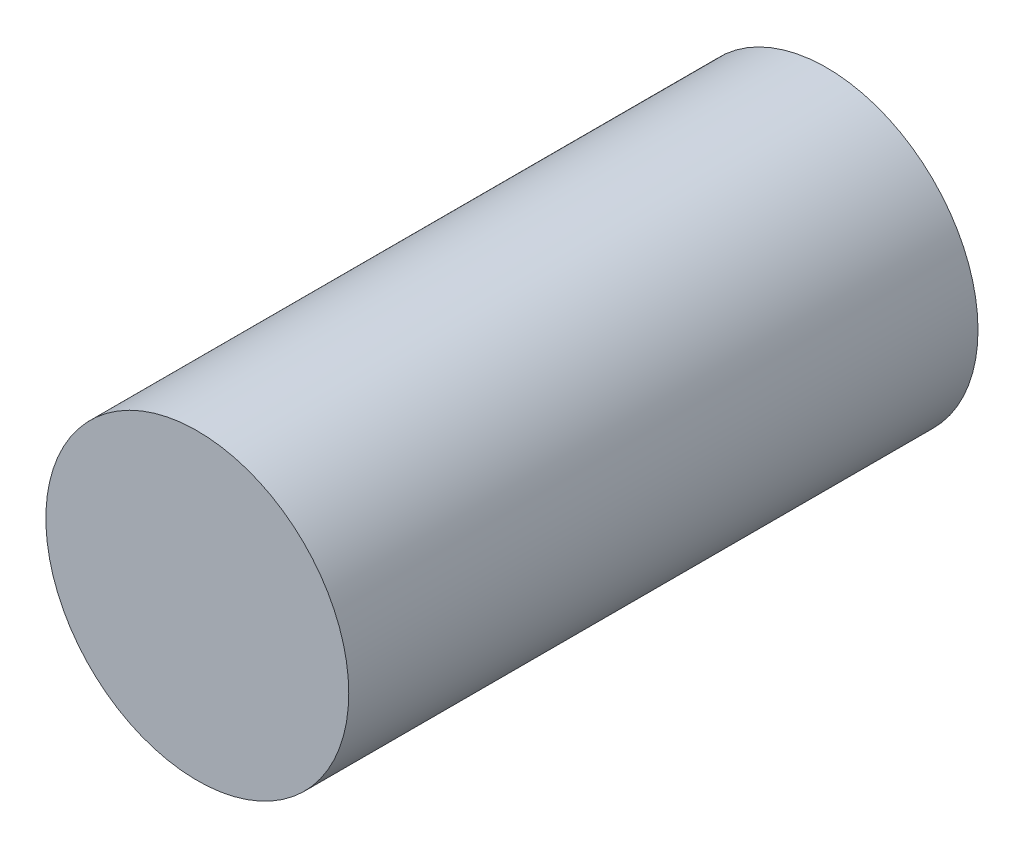
ISO-10303-21;
HEADER;
FILE_DESCRIPTION(('STEP AP214'),'2;1');
FILE_NAME('part.step','',(''),(''),'','','');
FILE_SCHEMA(('AUTOMOTIVE_DESIGN { 1 0 10303 214 1 1 1 1 }'));
ENDSEC;
DATA;
#1=APPLICATION_CONTEXT('core data for automotive mechanical design processes');
#2=APPLICATION_PROTOCOL_DEFINITION('international standard','automotive_design',2000,#1);
#3=PRODUCT_CONTEXT('',#1,'mechanical');
#4=PRODUCT('Part','Part','',(#3));
#5=PRODUCT_RELATED_PRODUCT_CATEGORY('part','',(#4));
#6=PRODUCT_DEFINITION_FORMATION('','',#4);
#7=PRODUCT_DEFINITION_CONTEXT('part definition',#1,'design');
#8=PRODUCT_DEFINITION('design','',#6,#7);
#9=PRODUCT_DEFINITION_SHAPE('','',#8);
#10=(LENGTH_UNIT() NAMED_UNIT(*) SI_UNIT(.MILLI.,.METRE.));
#11=(NAMED_UNIT(*) PLANE_ANGLE_UNIT() SI_UNIT($,.RADIAN.));
#12=(NAMED_UNIT(*) SI_UNIT($,.STERADIAN.) SOLID_ANGLE_UNIT());
#13=UNCERTAINTY_MEASURE_WITH_UNIT(LENGTH_MEASURE(1.E-05),#10,'distance_accuracy_value','');
#14=(GEOMETRIC_REPRESENTATION_CONTEXT(3) GLOBAL_UNCERTAINTY_ASSIGNED_CONTEXT((#13)) GLOBAL_UNIT_ASSIGNED_CONTEXT((#10,
#11,#12)) REPRESENTATION_CONTEXT('',''));
#15=CARTESIAN_POINT('',(0.,0.,0.));
#16=DIRECTION('',(0.,0.,1.));
#17=DIRECTION('',(1.,0.,0.));
#18=AXIS2_PLACEMENT_3D('',#15,#16,#17);
#19=CARTESIAN_POINT('',(0.,0.,12.5));
#20=DIRECTION('',(0.,0.,-1.));
#21=DIRECTION('',(-1.,0.,0.));
#22=AXIS2_PLACEMENT_3D('',#19,#20,#21);
#23=CYLINDRICAL_SURFACE('',#22,6.0175);
#24=CARTESIAN_POINT('',(0.,0.,12.5));
#25=DIRECTION('',(0.,0.,1.));
#26=DIRECTION('',(1.,0.,0.));
#27=AXIS2_PLACEMENT_3D('',#24,#25,#26);
#28=CIRCLE('',#27,6.0175);
#29=CARTESIAN_POINT('',(6.0175,0.,12.5));
#30=VERTEX_POINT('',#29);
#31=EDGE_CURVE('E10',#30,#30,#28,.T.);
#32=ORIENTED_EDGE('',*,*,#31,.F.);
#33=EDGE_LOOP('',(#32));
#34=FACE_BOUND('',#33,.T.);
#35=CARTESIAN_POINT('',(0.,0.,-12.5));
#36=DIRECTION('',(0.,0.,1.));
#37=DIRECTION('',(1.,0.,0.));
#38=AXIS2_PLACEMENT_3D('',#35,#36,#37);
#39=CIRCLE('',#38,6.0175);
#40=CARTESIAN_POINT('',(6.0175,0.,-12.5));
#41=VERTEX_POINT('',#40);
#42=EDGE_CURVE('E44',#41,#41,#39,.T.);
#43=ORIENTED_EDGE('',*,*,#42,.T.);
#44=EDGE_LOOP('',(#43));
#45=FACE_BOUND('',#44,.T.);
#46=ADVANCED_FACE('F41',(#34,#45),#23,.T.);
#47=CARTESIAN_POINT('',(0.,0.,12.5));
#48=DIRECTION('',(0.,0.,1.));
#49=DIRECTION('',(1.,0.,0.));
#50=AXIS2_PLACEMENT_3D('',#47,#48,#49);
#51=PLANE('',#50);
#52=ORIENTED_EDGE('',*,*,#31,.T.);
#53=EDGE_LOOP('',(#52));
#54=FACE_BOUND('',#53,.T.);
#55=ADVANCED_FACE('F58',(#54),#51,.T.);
#56=CARTESIAN_POINT('',(0.,0.,-12.5));
#57=DIRECTION('',(0.,0.,1.));
#58=DIRECTION('',(1.,0.,0.));
#59=AXIS2_PLACEMENT_3D('',#56,#57,#58);
#60=PLANE('',#59);
#61=ORIENTED_EDGE('',*,*,#42,.F.);
#62=EDGE_LOOP('',(#61));
#63=FACE_BOUND('',#62,.T.);
#64=ADVANCED_FACE('F56',(#63),#60,.F.);
#65=CLOSED_SHELL('',(#46,#55,#64));
#66=MANIFOLD_SOLID_BREP('B2',#65);
#67=ADVANCED_BREP_SHAPE_REPRESENTATION('',(#18,#66),#14);
#68=SHAPE_DEFINITION_REPRESENTATION(#9,#67);
ENDSEC;
END-ISO-10303-21;
